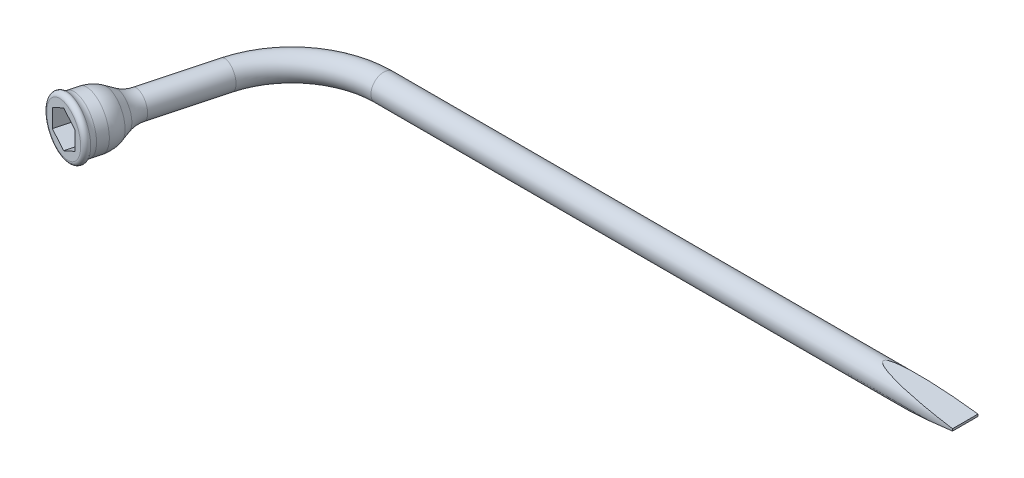
ISO-10303-21;
HEADER;
FILE_DESCRIPTION(('STEP AP214'),'2;1');
FILE_NAME('part.step','',(''),(''),'','','');
FILE_SCHEMA(('AUTOMOTIVE_DESIGN { 1 0 10303 214 1 1 1 1 }'));
ENDSEC;
DATA;
#1=APPLICATION_CONTEXT('core data for automotive mechanical design processes');
#2=APPLICATION_PROTOCOL_DEFINITION('international standard','automotive_design',2000,#1);
#3=PRODUCT_CONTEXT('',#1,'mechanical');
#4=PRODUCT('Part','Part','',(#3));
#5=PRODUCT_RELATED_PRODUCT_CATEGORY('part','',(#4));
#6=PRODUCT_DEFINITION_FORMATION('','',#4);
#7=PRODUCT_DEFINITION_CONTEXT('part definition',#1,'design');
#8=PRODUCT_DEFINITION('design','',#6,#7);
#9=PRODUCT_DEFINITION_SHAPE('','',#8);
#10=(LENGTH_UNIT() NAMED_UNIT(*) SI_UNIT(.MILLI.,.METRE.));
#11=(NAMED_UNIT(*) PLANE_ANGLE_UNIT() SI_UNIT($,.RADIAN.));
#12=(NAMED_UNIT(*) SI_UNIT($,.STERADIAN.) SOLID_ANGLE_UNIT());
#13=UNCERTAINTY_MEASURE_WITH_UNIT(LENGTH_MEASURE(1.E-05),#10,'distance_accuracy_value','');
#14=(GEOMETRIC_REPRESENTATION_CONTEXT(3) GLOBAL_UNCERTAINTY_ASSIGNED_CONTEXT((#13)) GLOBAL_UNIT_ASSIGNED_CONTEXT((#10,
#11,#12)) REPRESENTATION_CONTEXT('',''));
#15=CARTESIAN_POINT('',(0.,0.,0.));
#16=DIRECTION('',(0.,0.,1.));
#17=DIRECTION('',(1.,0.,0.));
#18=AXIS2_PLACEMENT_3D('',#15,#16,#17);
#19=CARTESIAN_POINT('',(43.8911037123964,0.,0.));
#20=DIRECTION('',(1.,0.,0.));
#21=DIRECTION('',(0.,0.,-1.));
#22=AXIS2_PLACEMENT_3D('',#19,#20,#21);
#23=CYLINDRICAL_SURFACE('',#22,7.95);
#24=CARTESIAN_POINT('',(43.8911037123964,0.,0.));
#25=DIRECTION('',(1.,0.,0.));
#26=DIRECTION('',(0.,0.,-1.));
#27=AXIS2_PLACEMENT_3D('',#24,#25,#26);
#28=CIRCLE('',#27,7.95);
#29=CARTESIAN_POINT('',(43.8911037123964,0.,-7.94999999999999));
#30=VERTEX_POINT('',#29);
#31=EDGE_CURVE('E111',#30,#30,#28,.T.);
#32=ORIENTED_EDGE('',*,*,#31,.T.);
#33=EDGE_LOOP('',(#32));
#34=FACE_BOUND('',#33,.T.);
#35=CARTESIAN_POINT('',(406.4,0.,0.));
#36=DIRECTION('',(1.,0.,0.));
#37=DIRECTION('',(0.,0.,-1.));
#38=AXIS2_PLACEMENT_3D('',#35,#36,#37);
#39=CIRCLE('',#38,7.95);
#40=CARTESIAN_POINT('',(406.4,0.649999999999999,7.92338311581612));
#41=VERTEX_POINT('',#40);
#42=CARTESIAN_POINT('',(406.4,-0.650000000000001,7.92338311581609));
#43=VERTEX_POINT('',#42);
#44=EDGE_CURVE('E98',#41,#43,#39,.T.);
#45=ORIENTED_EDGE('',*,*,#44,.F.);
#46=CARTESIAN_POINT('',(410.941095890411,0.,0.));
#47=DIRECTION('',(0.141693091083961,0.989910636340004,0.));
#48=DIRECTION('',(0.989910636340004,-0.141693091083961,0.));
#49=AXIS2_PLACEMENT_3D('',#46,#47,#48);
#50=ELLIPSE('',#49,56.1071816500154,7.95);
#51=CARTESIAN_POINT('',(406.4,0.649999999999999,-7.92338311581609));
#52=VERTEX_POINT('',#51);
#53=EDGE_CURVE('E103',#41,#52,#50,.F.);
#54=ORIENTED_EDGE('',*,*,#53,.T.);
#55=CARTESIAN_POINT('',(406.4,-0.650000000000001,-7.92338311581612));
#56=VERTEX_POINT('',#55);
#57=EDGE_CURVE('E48',#56,#52,#39,.T.);
#58=ORIENTED_EDGE('',*,*,#57,.F.);
#59=CARTESIAN_POINT('',(410.941095890411,0.,0.));
#60=DIRECTION('',(0.141693091083962,-0.989910636340004,0.));
#61=DIRECTION('',(0.989910636340004,0.141693091083962,0.));
#62=AXIS2_PLACEMENT_3D('',#59,#60,#61);
#63=ELLIPSE('',#62,56.1071816500153,7.95);
#64=EDGE_CURVE('E97',#56,#43,#63,.F.);
#65=ORIENTED_EDGE('',*,*,#64,.T.);
#66=EDGE_LOOP('',(#45,#54,#58,#65));
#67=FACE_BOUND('',#66,.T.);
#68=ADVANCED_FACE('F32',(#34,#67),#23,.T.);
#69=CARTESIAN_POINT('',(406.4,0.,0.));
#70=DIRECTION('',(1.,0.,0.));
#71=DIRECTION('',(0.,0.,-1.));
#72=AXIS2_PLACEMENT_3D('',#69,#70,#71);
#73=PLANE('',#72);
#74=DIRECTION('',(0.,0.,-1.));
#75=VECTOR('',#74,1.);
#76=CARTESIAN_POINT('',(406.4,-0.650000000000001,0.));
#77=LINE('',#76,#75);
#78=EDGE_CURVE('E36',#43,#56,#77,.T.);
#79=ORIENTED_EDGE('',*,*,#78,.T.);
#80=ORIENTED_EDGE('',*,*,#57,.T.);
#81=DIRECTION('',(0.,0.,-1.));
#82=VECTOR('',#81,1.);
#83=CARTESIAN_POINT('',(406.4,0.649999999999999,700.148681079432));
#84=LINE('',#83,#82);
#85=EDGE_CURVE('E11',#41,#52,#84,.T.);
#86=ORIENTED_EDGE('',*,*,#85,.F.);
#87=ORIENTED_EDGE('',*,*,#44,.T.);
#88=EDGE_LOOP('',(#79,#80,#86,#87));
#89=FACE_BOUND('',#88,.T.);
#90=ADVANCED_FACE('F105',(#89),#73,.T.);
#91=CARTESIAN_POINT('',(-11.3598535513383,0.,42.3955506201356));
#92=DIRECTION('',(-0.258819045102525,0.,0.965925826289067));
#93=DIRECTION('',(0.965925826289067,0.,0.258819045102525));
#94=AXIS2_PLACEMENT_3D('',#91,#92,#93);
#95=CYLINDRICAL_SURFACE('',#94,7.95);
#96=CARTESIAN_POINT('',(-23.0090131096145,0.,85.8708059570981));
#97=DIRECTION('',(0.258819045102525,0.,-0.965925826289067));
#98=DIRECTION('',(-0.965925826289067,0.,-0.258819045102525));
#99=AXIS2_PLACEMENT_3D('',#96,#97,#98);
#100=CIRCLE('',#99,7.94999999999999);
#101=CARTESIAN_POINT('',(-30.6881234286125,0.,83.813194548533));
#102=VERTEX_POINT('',#101);
#103=EDGE_CURVE('E134',#102,#102,#100,.T.);
#104=ORIENTED_EDGE('',*,*,#103,.T.);
#105=EDGE_LOOP('',(#104));
#106=FACE_BOUND('',#105,.T.);
#107=CARTESIAN_POINT('',(-11.3598535513383,0.,42.3955506201356));
#108=DIRECTION('',(0.258819045102525,0.,-0.965925826289067));
#109=DIRECTION('',(-0.965925826289067,0.,-0.258819045102525));
#110=AXIS2_PLACEMENT_3D('',#107,#108,#109);
#111=CIRCLE('',#110,7.95);
#112=CARTESIAN_POINT('',(-19.0389638703364,0.,40.3379392115705));
#113=VERTEX_POINT('',#112);
#114=EDGE_CURVE('E109',#113,#113,#111,.T.);
#115=ORIENTED_EDGE('',*,*,#114,.F.);
#116=EDGE_LOOP('',(#115));
#117=FACE_BOUND('',#116,.T.);
#118=ADVANCED_FACE('F34',(#106,#117),#95,.T.);
#119=CARTESIAN_POINT('',(43.8911037123963,0.,57.2));
#120=DIRECTION('',(0.,1.,0.));
#121=DIRECTION('',(0.,0.,1.));
#122=AXIS2_PLACEMENT_3D('',#119,#120,#121);
#123=TOROIDAL_SURFACE('',#122,57.2,7.95);
#124=CARTESIAN_POINT('',(43.8911037123963,0.,57.2));
#125=DIRECTION('',(0.,1.,0.));
#126=DIRECTION('',(0.,0.,1.));
#127=AXIS2_PLACEMENT_3D('',#124,#125,#126);
#128=CIRCLE('',#127,65.15);
#129=EDGE_CURVE('',#30,#113,#128,.T.);
#130=ORIENTED_EDGE('',*,*,#31,.F.);
#131=ORIENTED_EDGE('',*,*,#114,.T.);
#132=ORIENTED_EDGE('',*,*,#129,.T.);
#133=ORIENTED_EDGE('',*,*,#129,.F.);
#134=EDGE_LOOP('',(#130,#132,#131,#133));
#135=FACE_BOUND('',#134,.T.);
#136=ADVANCED_FACE('F248',(#135),#123,.T.);
#137=CARTESIAN_POINT('',(-32.2229711152643,0.,120.257765372989));
#138=DIRECTION('',(0.258819045102525,0.,-0.965925826289067));
#139=DIRECTION('',(-0.965925826289067,0.,-0.258819045102525));
#140=AXIS2_PLACEMENT_3D('',#137,#138,#139);
#141=TOROIDAL_SURFACE('',#140,14.95,2.49999999999998);
#142=CARTESIAN_POINT('',(-32.8700187280206,0.,122.672579938712));
#143=DIRECTION('',(0.258819045102525,0.,-0.965925826289067));
#144=DIRECTION('',(-0.965925826289067,0.,-0.258819045102525));
#145=AXIS2_PLACEMENT_3D('',#142,#143,#144);
#146=CIRCLE('',#145,14.95);
#147=CARTESIAN_POINT('',(-47.3106098310422,0.,118.803235214429));
#148=VERTEX_POINT('',#147);
#149=EDGE_CURVE('E106',#148,#148,#146,.T.);
#150=ORIENTED_EDGE('',*,*,#149,.T.);
#151=EDGE_LOOP('',(#150));
#152=FACE_BOUND('',#151,.T.);
#153=CARTESIAN_POINT('',(-31.8581006047408,0.,118.896050089531));
#154=DIRECTION('',(0.258819045102525,0.,-0.965925826289067));
#155=DIRECTION('',(-0.965925826289067,0.,-0.258819045102525));
#156=AXIS2_PLACEMENT_3D('',#153,#154,#155);
#157=CIRCLE('',#156,17.014606741573);
#158=CARTESIAN_POINT('',(-48.2929486805782,0.,114.492345819883));
#159=VERTEX_POINT('',#158);
#160=EDGE_CURVE('E119',#159,#159,#157,.T.);
#161=ORIENTED_EDGE('',*,*,#160,.F.);
#162=EDGE_LOOP('',(#161));
#163=FACE_BOUND('',#162,.T.);
#164=ADVANCED_FACE('F250',(#152,#163),#141,.T.);
#165=CARTESIAN_POINT('',(-30.9240320978006,0.,115.410058963881));
#166=DIRECTION('',(0.258819045102525,0.,-0.965925826289067));
#167=DIRECTION('',(-0.965925826289067,0.,-0.258819045102525));
#168=AXIS2_PLACEMENT_3D('',#165,#166,#167);
#169=TOROIDAL_SURFACE('',#168,22.3,6.4);
#170=ORIENTED_EDGE('',*,*,#160,.T.);
#171=EDGE_LOOP('',(#170));
#172=FACE_BOUND('',#171,.T.);
#173=CARTESIAN_POINT('',(-30.9240320978006,0.,115.410058963881));
#174=DIRECTION('',(0.258819045102525,0.,-0.965925826289067));
#175=DIRECTION('',(-0.965925826289067,0.,-0.258819045102525));
#176=AXIS2_PLACEMENT_3D('',#173,#174,#175);
#177=CIRCLE('',#176,15.9);
#178=CARTESIAN_POINT('',(-46.2822527357967,0.,111.29483614675));
#179=VERTEX_POINT('',#178);
#180=EDGE_CURVE('E122',#179,#179,#177,.T.);
#181=ORIENTED_EDGE('',*,*,#180,.F.);
#182=EDGE_LOOP('',(#181));
#183=FACE_BOUND('',#182,.T.);
#184=ADVANCED_FACE('F256',(#172,#183),#169,.F.);
#185=CARTESIAN_POINT('',(-15.1267657655725,0.,56.4538583913093));
#186=DIRECTION('',(0.258819045102525,0.,-0.965925826289067));
#187=DIRECTION('',(-0.965925826289067,0.,-0.258819045102525));
#188=AXIS2_PLACEMENT_3D('',#185,#186,#187);
#189=CYLINDRICAL_SURFACE('',#188,15.9);
#190=ORIENTED_EDGE('',*,*,#180,.T.);
#191=EDGE_LOOP('',(#190));
#192=FACE_BOUND('',#191,.T.);
#193=CARTESIAN_POINT('',(-29.237556879573,0.,109.11604776375));
#194=DIRECTION('',(0.258819045102525,0.,-0.965925826289067));
#195=DIRECTION('',(-0.965925826289067,0.,-0.258819045102525));
#196=AXIS2_PLACEMENT_3D('',#193,#194,#195);
#197=CIRCLE('',#196,15.9);
#198=CARTESIAN_POINT('',(-44.5957775175691,0.,105.000824946619));
#199=VERTEX_POINT('',#198);
#200=EDGE_CURVE('E125',#199,#199,#197,.T.);
#201=ORIENTED_EDGE('',*,*,#200,.F.);
#202=EDGE_LOOP('',(#201));
#203=FACE_BOUND('',#202,.T.);
#204=ADVANCED_FACE('F286',(#192,#203),#189,.T.);
#205=CARTESIAN_POINT('',(-29.237556879573,0.,109.11604776375));
#206=DIRECTION('',(0.258819045102525,0.,-0.965925826289067));
#207=DIRECTION('',(-0.965925826289067,0.,-0.258819045102525));
#208=AXIS2_PLACEMENT_3D('',#205,#206,#207);
#209=DEGENERATE_TOROIDAL_SURFACE('',#208,3.20000000000003,19.1,.F.);
#210=ORIENTED_EDGE('',*,*,#200,.T.);
#211=EDGE_LOOP('',(#210));
#212=FACE_BOUND('',#211,.T.);
#213=CARTESIAN_POINT('',(-26.7878765285635,0.,99.973716231479));
#214=DIRECTION('',(0.258819045102525,0.,-0.965925826289067));
#215=DIRECTION('',(-0.965925826289067,0.,-0.258819045102525));
#216=AXIS2_PLACEMENT_3D('',#213,#214,#215);
#217=CIRCLE('',#216,13.3899620352769);
#218=CARTESIAN_POINT('',(-39.7215866714675,0.,96.5081390435496));
#219=VERTEX_POINT('',#218);
#220=EDGE_CURVE('E128',#219,#219,#217,.T.);
#221=ORIENTED_EDGE('',*,*,#220,.F.);
#222=EDGE_LOOP('',(#221));
#223=FACE_BOUND('',#222,.T.);
#224=ADVANCED_FACE('F278',(#212,#223),#209,.F.);
#225=CARTESIAN_POINT('',(-25.458693460624,0.,95.0131374893686));
#226=DIRECTION('',(-0.258819045102525,0.,0.965925826289067));
#227=DIRECTION('',(0.965925826289067,0.,0.258819045102525));
#228=AXIS2_PLACEMENT_3D('',#225,#226,#227);
#229=CONICAL_SURFACE('',#228,10.4600379647231,0.518457872986273);
#230=ORIENTED_EDGE('',*,*,#220,.T.);
#231=EDGE_LOOP('',(#230));
#232=FACE_BOUND('',#231,.T.);
#233=CARTESIAN_POINT('',(-25.458693460624,0.,95.0131374893686));
#234=DIRECTION('',(0.258819045102525,0.,-0.965925826289067));
#235=DIRECTION('',(-0.965925826289067,0.,-0.258819045102525));
#236=AXIS2_PLACEMENT_3D('',#233,#234,#235);
#237=CIRCLE('',#236,10.4600379647231);
#238=CARTESIAN_POINT('',(-35.5623142747141,0.,92.3058804516028));
#239=VERTEX_POINT('',#238);
#240=EDGE_CURVE('E131',#239,#239,#237,.T.);
#241=ORIENTED_EDGE('',*,*,#240,.F.);
#242=EDGE_LOOP('',(#241));
#243=FACE_BOUND('',#242,.T.);
#244=ADVANCED_FACE('F269',(#232,#243),#229,.T.);
#245=CARTESIAN_POINT('',(-23.0090131096145,0.,85.8708059570981));
#246=DIRECTION('',(0.258819045102525,0.,-0.965925826289067));
#247=DIRECTION('',(-0.965925826289067,0.,-0.258819045102525));
#248=AXIS2_PLACEMENT_3D('',#245,#246,#247);
#249=TOROIDAL_SURFACE('',#248,27.05,19.1);
#250=ORIENTED_EDGE('',*,*,#240,.T.);
#251=EDGE_LOOP('',(#250));
#252=FACE_BOUND('',#251,.T.);
#253=ORIENTED_EDGE('',*,*,#103,.F.);
#254=EDGE_LOOP('',(#253));
#255=FACE_BOUND('',#254,.T.);
#256=ADVANCED_FACE('F266',(#252,#255),#249,.F.);
#257=CARTESIAN_POINT('',(-32.8700187280206,0.,122.672579938712));
#258=DIRECTION('',(0.258819045102525,0.,-0.965925826289067));
#259=DIRECTION('',(-0.965925826289067,0.,-0.258819045102525));
#260=AXIS2_PLACEMENT_3D('',#257,#258,#259);
#261=PLANE('',#260);
#262=DIRECTION('',(0.,1.,0.));
#263=VECTOR('',#262,1.);
#264=CARTESIAN_POINT('',(-23.21076046513,-5.77350269189626,125.260770389737));
#265=LINE('',#264,#263);
#266=CARTESIAN_POINT('',(-23.21076046513,-5.77350269189626,125.260770389737));
#267=VERTEX_POINT('',#266);
#268=CARTESIAN_POINT('',(-23.21076046513,5.77350269189626,125.260770389737));
#269=VERTEX_POINT('',#268);
#270=EDGE_CURVE('E164',#267,#269,#265,.T.);
#271=ORIENTED_EDGE('',*,*,#270,.F.);
#272=DIRECTION('',(0.836516303737807,0.5,0.224143868042016));
#273=VECTOR('',#272,1.);
#274=CARTESIAN_POINT('',(-32.8700187280206,-11.5470053837925,122.672579938712));
#275=LINE('',#274,#273);
#276=CARTESIAN_POINT('',(-32.8700187280206,-11.5470053837925,122.672579938712));
#277=VERTEX_POINT('',#276);
#278=EDGE_CURVE('E167',#277,#267,#275,.T.);
#279=ORIENTED_EDGE('',*,*,#278,.F.);
#280=DIRECTION('',(0.836516303737807,-0.5,0.224143868042017));
#281=VECTOR('',#280,1.);
#282=CARTESIAN_POINT('',(-42.5292769909113,-5.77350269189626,120.084389487686));
#283=LINE('',#282,#281);
#284=CARTESIAN_POINT('',(-42.5292769909113,-5.77350269189626,120.084389487686));
#285=VERTEX_POINT('',#284);
#286=EDGE_CURVE('E151',#285,#277,#283,.T.);
#287=ORIENTED_EDGE('',*,*,#286,.F.);
#288=DIRECTION('',(0.,-1.,0.));
#289=VECTOR('',#288,1.);
#290=CARTESIAN_POINT('',(-42.5292769909113,5.77350269189626,120.084389487686));
#291=LINE('',#290,#289);
#292=CARTESIAN_POINT('',(-42.5292769909113,5.77350269189626,120.084389487686));
#293=VERTEX_POINT('',#292);
#294=EDGE_CURVE('E155',#293,#285,#291,.T.);
#295=ORIENTED_EDGE('',*,*,#294,.F.);
#296=DIRECTION('',(-0.836516303737807,-0.5,-0.224143868042017));
#297=VECTOR('',#296,1.);
#298=CARTESIAN_POINT('',(-32.8700187280206,11.5470053837925,122.672579938712));
#299=LINE('',#298,#297);
#300=CARTESIAN_POINT('',(-32.8700187280206,11.5470053837925,122.672579938712));
#301=VERTEX_POINT('',#300);
#302=EDGE_CURVE('E158',#301,#293,#299,.T.);
#303=ORIENTED_EDGE('',*,*,#302,.F.);
#304=DIRECTION('',(-0.836516303737807,0.5,-0.224143868042016));
#305=VECTOR('',#304,1.);
#306=CARTESIAN_POINT('',(-23.21076046513,5.77350269189626,125.260770389737));
#307=LINE('',#306,#305);
#308=EDGE_CURVE('E161',#269,#301,#307,.T.);
#309=ORIENTED_EDGE('',*,*,#308,.F.);
#310=EDGE_LOOP('',(#271,#279,#287,#295,#303,#309));
#311=FACE_BOUND('',#310,.T.);
#312=ORIENTED_EDGE('',*,*,#149,.F.);
#313=EDGE_LOOP('',(#312));
#314=FACE_BOUND('',#313,.T.);
#315=ADVANCED_FACE('F268',(#311,#314),#261,.F.);
#316=CARTESIAN_POINT('',(-29.5830168552186,-11.5470053837925,110.40532194484));
#317=DIRECTION('',(0.482962913144534,-0.866025403784439,0.129409522551262));
#318=DIRECTION('',(0.873369362327711,0.487058473848149,0.));
#319=AXIS2_PLACEMENT_3D('',#316,#317,#318);
#320=PLANE('',#319);
#321=ORIENTED_EDGE('',*,*,#278,.T.);
#322=DIRECTION('',(-0.258819045102525,0.,0.965925826289067));
#323=VECTOR('',#322,1.);
#324=CARTESIAN_POINT('',(-19.9237585923279,-5.77350269189626,112.993512395866));
#325=LINE('',#324,#323);
#326=CARTESIAN_POINT('',(-19.9237585923279,-5.77350269189626,112.993512395866));
#327=VERTEX_POINT('',#326);
#328=EDGE_CURVE('E138',#327,#267,#325,.T.);
#329=ORIENTED_EDGE('',*,*,#328,.F.);
#330=DIRECTION('',(0.836516303737807,0.5,0.224143868042016));
#331=VECTOR('',#330,1.);
#332=CARTESIAN_POINT('',(-29.5830168552186,-11.5470053837925,110.40532194484));
#333=LINE('',#332,#331);
#334=CARTESIAN_POINT('',(-29.5830168552186,-11.5470053837925,110.40532194484));
#335=VERTEX_POINT('',#334);
#336=EDGE_CURVE('E154',#335,#327,#333,.T.);
#337=ORIENTED_EDGE('',*,*,#336,.F.);
#338=DIRECTION('',(-0.258819045102525,0.,0.965925826289067));
#339=VECTOR('',#338,1.);
#340=CARTESIAN_POINT('',(-29.5830168552186,-11.5470053837925,110.40532194484));
#341=LINE('',#340,#339);
#342=EDGE_CURVE('E137',#335,#277,#341,.T.);
#343=ORIENTED_EDGE('',*,*,#342,.T.);
#344=EDGE_LOOP('',(#321,#329,#337,#343));
#345=FACE_BOUND('',#344,.T.);
#346=ADVANCED_FACE('F276',(#345),#320,.F.);
#347=CARTESIAN_POINT('',(-39.2422751181092,-5.77350269189626,107.817131493815));
#348=DIRECTION('',(-0.482962913144534,-0.866025403784439,-0.129409522551262));
#349=DIRECTION('',(0.873369362327711,-0.487058473848148,0.));
#350=AXIS2_PLACEMENT_3D('',#347,#348,#349);
#351=PLANE('',#350);
#352=ORIENTED_EDGE('',*,*,#286,.T.);
#353=ORIENTED_EDGE('',*,*,#342,.F.);
#354=DIRECTION('',(0.836516303737807,-0.5,0.224143868042017));
#355=VECTOR('',#354,1.);
#356=CARTESIAN_POINT('',(-39.2422751181092,-5.77350269189626,107.817131493815));
#357=LINE('',#356,#355);
#358=CARTESIAN_POINT('',(-39.2422751181092,-5.77350269189626,107.817131493815));
#359=VERTEX_POINT('',#358);
#360=EDGE_CURVE('E142',#359,#335,#357,.T.);
#361=ORIENTED_EDGE('',*,*,#360,.F.);
#362=DIRECTION('',(-0.258819045102525,0.,0.965925826289067));
#363=VECTOR('',#362,1.);
#364=CARTESIAN_POINT('',(-39.2422751181092,-5.77350269189626,107.817131493815));
#365=LINE('',#364,#363);
#366=EDGE_CURVE('E148',#359,#285,#365,.T.);
#367=ORIENTED_EDGE('',*,*,#366,.T.);
#368=EDGE_LOOP('',(#352,#353,#361,#367));
#369=FACE_BOUND('',#368,.T.);
#370=ADVANCED_FACE('F339',(#369),#351,.F.);
#371=CARTESIAN_POINT('',(-39.2422751181092,5.77350269189626,107.817131493815));
#372=DIRECTION('',(-0.965925826289067,0.,-0.258819045102525));
#373=DIRECTION('',(-0.258819045102525,0.,0.965925826289067));
#374=AXIS2_PLACEMENT_3D('',#371,#372,#373);
#375=PLANE('',#374);
#376=ORIENTED_EDGE('',*,*,#294,.T.);
#377=ORIENTED_EDGE('',*,*,#366,.F.);
#378=DIRECTION('',(0.,-1.,0.));
#379=VECTOR('',#378,1.);
#380=CARTESIAN_POINT('',(-39.2422751181092,5.77350269189626,107.817131493815));
#381=LINE('',#380,#379);
#382=CARTESIAN_POINT('',(-39.2422751181092,5.77350269189626,107.817131493815));
#383=VERTEX_POINT('',#382);
#384=EDGE_CURVE('E172',#383,#359,#381,.T.);
#385=ORIENTED_EDGE('',*,*,#384,.F.);
#386=DIRECTION('',(-0.258819045102525,0.,0.965925826289067));
#387=VECTOR('',#386,1.);
#388=CARTESIAN_POINT('',(-39.2422751181092,5.77350269189626,107.817131493815));
#389=LINE('',#388,#387);
#390=EDGE_CURVE('E146',#383,#293,#389,.T.);
#391=ORIENTED_EDGE('',*,*,#390,.T.);
#392=EDGE_LOOP('',(#376,#377,#385,#391));
#393=FACE_BOUND('',#392,.T.);
#394=ADVANCED_FACE('F348',(#393),#375,.F.);
#395=CARTESIAN_POINT('',(-29.5830168552186,11.5470053837925,110.40532194484));
#396=DIRECTION('',(-0.482962913144534,0.866025403784439,-0.129409522551262));
#397=DIRECTION('',(-0.873369362327711,-0.487058473848148,0.));
#398=AXIS2_PLACEMENT_3D('',#395,#396,#397);
#399=PLANE('',#398);
#400=ORIENTED_EDGE('',*,*,#302,.T.);
#401=ORIENTED_EDGE('',*,*,#390,.F.);
#402=DIRECTION('',(-0.836516303737807,-0.5,-0.224143868042017));
#403=VECTOR('',#402,1.);
#404=CARTESIAN_POINT('',(-29.5830168552186,11.5470053837925,110.40532194484));
#405=LINE('',#404,#403);
#406=CARTESIAN_POINT('',(-29.5830168552186,11.5470053837925,110.40532194484));
#407=VERTEX_POINT('',#406);
#408=EDGE_CURVE('E174',#407,#383,#405,.T.);
#409=ORIENTED_EDGE('',*,*,#408,.F.);
#410=DIRECTION('',(-0.258819045102525,0.,0.965925826289067));
#411=VECTOR('',#410,1.);
#412=CARTESIAN_POINT('',(-29.5830168552186,11.5470053837925,110.40532194484));
#413=LINE('',#412,#411);
#414=EDGE_CURVE('E144',#407,#301,#413,.T.);
#415=ORIENTED_EDGE('',*,*,#414,.T.);
#416=EDGE_LOOP('',(#400,#401,#409,#415));
#417=FACE_BOUND('',#416,.T.);
#418=ADVANCED_FACE('F358',(#417),#399,.F.);
#419=CARTESIAN_POINT('',(-19.9237585923279,5.77350269189626,112.993512395866));
#420=DIRECTION('',(0.482962913144534,0.866025403784439,0.129409522551262));
#421=DIRECTION('',(-0.873369362327711,0.487058473848148,0.));
#422=AXIS2_PLACEMENT_3D('',#419,#420,#421);
#423=PLANE('',#422);
#424=ORIENTED_EDGE('',*,*,#308,.T.);
#425=ORIENTED_EDGE('',*,*,#414,.F.);
#426=DIRECTION('',(-0.836516303737807,0.5,-0.224143868042016));
#427=VECTOR('',#426,1.);
#428=CARTESIAN_POINT('',(-19.9237585923279,5.77350269189626,112.993512395866));
#429=LINE('',#428,#427);
#430=CARTESIAN_POINT('',(-19.9237585923279,5.77350269189626,112.993512395866));
#431=VERTEX_POINT('',#430);
#432=EDGE_CURVE('E177',#431,#407,#429,.T.);
#433=ORIENTED_EDGE('',*,*,#432,.F.);
#434=DIRECTION('',(-0.258819045102525,0.,0.965925826289067));
#435=VECTOR('',#434,1.);
#436=CARTESIAN_POINT('',(-19.9237585923279,5.77350269189626,112.993512395866));
#437=LINE('',#436,#435);
#438=EDGE_CURVE('E141',#431,#269,#437,.T.);
#439=ORIENTED_EDGE('',*,*,#438,.T.);
#440=EDGE_LOOP('',(#424,#425,#433,#439));
#441=FACE_BOUND('',#440,.T.);
#442=ADVANCED_FACE('F368',(#441),#423,.F.);
#443=CARTESIAN_POINT('',(-19.9237585923279,-5.77350269189626,112.993512395866));
#444=DIRECTION('',(0.965925826289067,0.,0.258819045102525));
#445=DIRECTION('',(0.258819045102525,0.,-0.965925826289067));
#446=AXIS2_PLACEMENT_3D('',#443,#444,#445);
#447=PLANE('',#446);
#448=ORIENTED_EDGE('',*,*,#270,.T.);
#449=ORIENTED_EDGE('',*,*,#438,.F.);
#450=DIRECTION('',(0.,1.,0.));
#451=VECTOR('',#450,1.);
#452=CARTESIAN_POINT('',(-19.9237585923279,-5.77350269189626,112.993512395866));
#453=LINE('',#452,#451);
#454=EDGE_CURVE('E180',#327,#431,#453,.T.);
#455=ORIENTED_EDGE('',*,*,#454,.F.);
#456=ORIENTED_EDGE('',*,*,#328,.T.);
#457=EDGE_LOOP('',(#448,#449,#455,#456));
#458=FACE_BOUND('',#457,.T.);
#459=ADVANCED_FACE('F378',(#458),#447,.F.);
#460=CARTESIAN_POINT('',(-39.2422751181092,5.77350269189626,107.817131493815));
#461=CARTESIAN_POINT('',(-37.1028703163086,5.48482755730145,101.764615728116));
#462=CARTESIAN_POINT('',(-27.9265749665624,0.,104.22339665659));
#463=CARTESIAN_POINT('',(-39.2422751181092,-5.77350269189626,107.817131493815));
#464=CARTESIAN_POINT('',(-37.1028703163086,-5.48482755730144,101.764615728116));
#465=CARTESIAN_POINT('',(-27.9265749665624,0.,104.22339665659));
#466=(BOUNDED_SURFACE() B_SPLINE_SURFACE(1,2,((#460,#461,#462),(#463,#464,#465)),.UNSPECIFIED.,
.F.,.F.,.F.) B_SPLINE_SURFACE_WITH_KNOTS((2,2),(3,3),(0.,1.),(0.,1.),
.UNSPECIFIED.) GEOMETRIC_REPRESENTATION_ITEM() RATIONAL_B_SPLINE_SURFACE(((1.,1.,1.),(1.,1.,1.))) REPRESENTATION_ITEM('') SURFACE());
#467=CARTESIAN_POINT('',(-39.2422751181092,-5.77350269189626,107.817131493815));
#468=CARTESIAN_POINT('',(-37.1028703163086,-5.48482755730144,101.764615728116));
#469=CARTESIAN_POINT('',(-27.9265749665624,0.,104.22339665659));
#470=(BOUNDED_CURVE() B_SPLINE_CURVE(2,(#467,#468,#469),.UNSPECIFIED.,.F.,
.F.) B_SPLINE_CURVE_WITH_KNOTS((3,3),(0.,1.),
.UNSPECIFIED.) CURVE() GEOMETRIC_REPRESENTATION_ITEM() RATIONAL_B_SPLINE_CURVE((1.,1.,1.)) REPRESENTATION_ITEM(''));
#471=CARTESIAN_POINT('',(-27.9265749665624,0.,104.22339665659));
#472=VERTEX_POINT('',#471);
#473=EDGE_CURVE('E185',#359,#472,#470,.T.);
#474=CARTESIAN_POINT('',(-39.2422751181092,5.77350269189626,107.817131493815));
#475=CARTESIAN_POINT('',(-37.1028703163086,5.48482755730145,101.764615728116));
#476=CARTESIAN_POINT('',(-27.9265749665624,0.,104.22339665659));
#477=(BOUNDED_CURVE() B_SPLINE_CURVE(2,(#474,#475,#476),.UNSPECIFIED.,.F.,
.F.) B_SPLINE_CURVE_WITH_KNOTS((3,3),(0.,1.),
.UNSPECIFIED.) CURVE() GEOMETRIC_REPRESENTATION_ITEM() RATIONAL_B_SPLINE_CURVE((1.,1.,1.)) REPRESENTATION_ITEM(''));
#478=EDGE_CURVE('E190',#383,#472,#477,.T.);
#479=ORIENTED_EDGE('',*,*,#384,.T.);
#480=ORIENTED_EDGE('',*,*,#473,.T.);
#481=ORIENTED_EDGE('',*,*,#478,.F.);
#482=EDGE_LOOP('',(#479,#480,#481));
#483=FACE_BOUND('',#482,.T.);
#484=ADVANCED_FACE('F388',(#483),#466,.T.);
#485=CARTESIAN_POINT('',(-29.5830168552186,11.5470053837925,110.40532194484));
#486=CARTESIAN_POINT('',(-27.9265749665624,10.9696551146029,104.22339665659));
#487=CARTESIAN_POINT('',(-27.9265749665624,0.,104.22339665659));
#488=CARTESIAN_POINT('',(-39.2422751181092,5.77350269189626,107.817131493815));
#489=CARTESIAN_POINT('',(-37.1028703163086,5.48482755730145,101.764615728116));
#490=CARTESIAN_POINT('',(-27.9265749665624,0.,104.22339665659));
#491=(BOUNDED_SURFACE() B_SPLINE_SURFACE(1,2,((#485,#486,#487),(#488,#489,#490)),.UNSPECIFIED.,
.F.,.F.,.F.) B_SPLINE_SURFACE_WITH_KNOTS((2,2),(3,3),(0.,1.),(0.,1.),
.UNSPECIFIED.) GEOMETRIC_REPRESENTATION_ITEM() RATIONAL_B_SPLINE_SURFACE(((1.,1.,1.),(1.,1.,1.))) REPRESENTATION_ITEM('') SURFACE());
#492=CARTESIAN_POINT('',(-29.5830168552186,11.5470053837925,110.40532194484));
#493=CARTESIAN_POINT('',(-27.9265749665624,10.9696551146029,104.22339665659));
#494=CARTESIAN_POINT('',(-27.9265749665624,0.,104.22339665659));
#495=(BOUNDED_CURVE() B_SPLINE_CURVE(2,(#492,#493,#494),.UNSPECIFIED.,.F.,
.F.) B_SPLINE_CURVE_WITH_KNOTS((3,3),(0.,1.),
.UNSPECIFIED.) CURVE() GEOMETRIC_REPRESENTATION_ITEM() RATIONAL_B_SPLINE_CURVE((1.,1.,1.)) REPRESENTATION_ITEM(''));
#496=EDGE_CURVE('E197',#407,#472,#495,.T.);
#497=ORIENTED_EDGE('',*,*,#408,.T.);
#498=ORIENTED_EDGE('',*,*,#478,.T.);
#499=ORIENTED_EDGE('',*,*,#496,.F.);
#500=EDGE_LOOP('',(#497,#498,#499));
#501=FACE_BOUND('',#500,.T.);
#502=ADVANCED_FACE('F397',(#501),#491,.T.);
#503=CARTESIAN_POINT('',(-19.9237585923279,5.77350269189626,112.993512395866));
#504=CARTESIAN_POINT('',(-18.7502796168163,5.48482755730145,106.682177585064));
#505=CARTESIAN_POINT('',(-27.9265749665624,0.,104.22339665659));
#506=CARTESIAN_POINT('',(-29.5830168552186,11.5470053837925,110.40532194484));
#507=CARTESIAN_POINT('',(-27.9265749665624,10.9696551146029,104.22339665659));
#508=CARTESIAN_POINT('',(-27.9265749665624,0.,104.22339665659));
#509=(BOUNDED_SURFACE() B_SPLINE_SURFACE(1,2,((#503,#504,#505),(#506,#507,#508)),.UNSPECIFIED.,
.F.,.F.,.F.) B_SPLINE_SURFACE_WITH_KNOTS((2,2),(3,3),(0.,1.),(0.,1.),
.UNSPECIFIED.) GEOMETRIC_REPRESENTATION_ITEM() RATIONAL_B_SPLINE_SURFACE(((1.,1.,1.),(1.,1.,1.))) REPRESENTATION_ITEM('') SURFACE());
#510=CARTESIAN_POINT('',(-19.9237585923279,5.77350269189626,112.993512395866));
#511=CARTESIAN_POINT('',(-18.7502796168163,5.48482755730145,106.682177585064));
#512=CARTESIAN_POINT('',(-27.9265749665624,0.,104.22339665659));
#513=(BOUNDED_CURVE() B_SPLINE_CURVE(2,(#510,#511,#512),.UNSPECIFIED.,.F.,
.F.) B_SPLINE_CURVE_WITH_KNOTS((3,3),(0.,1.),
.UNSPECIFIED.) CURVE() GEOMETRIC_REPRESENTATION_ITEM() RATIONAL_B_SPLINE_CURVE((1.,1.,1.)) REPRESENTATION_ITEM(''));
#514=EDGE_CURVE('E205',#431,#472,#513,.T.);
#515=ORIENTED_EDGE('',*,*,#432,.T.);
#516=ORIENTED_EDGE('',*,*,#496,.T.);
#517=ORIENTED_EDGE('',*,*,#514,.F.);
#518=EDGE_LOOP('',(#515,#516,#517));
#519=FACE_BOUND('',#518,.T.);
#520=ADVANCED_FACE('F407',(#519),#509,.T.);
#521=CARTESIAN_POINT('',(-39.2422751181092,-5.77350269189626,107.817131493815));
#522=CARTESIAN_POINT('',(-37.1028703163086,-5.48482755730144,101.764615728116));
#523=CARTESIAN_POINT('',(-27.9265749665624,0.,104.22339665659));
#524=CARTESIAN_POINT('',(-29.5830168552186,-11.5470053837925,110.40532194484));
#525=CARTESIAN_POINT('',(-27.9265749665624,-10.9696551146029,104.22339665659));
#526=CARTESIAN_POINT('',(-27.9265749665624,0.,104.22339665659));
#527=(BOUNDED_SURFACE() B_SPLINE_SURFACE(1,2,((#521,#522,#523),(#524,#525,#526)),.UNSPECIFIED.,
.F.,.F.,.F.) B_SPLINE_SURFACE_WITH_KNOTS((2,2),(3,3),(0.,1.),(0.,1.),
.UNSPECIFIED.) GEOMETRIC_REPRESENTATION_ITEM() RATIONAL_B_SPLINE_SURFACE(((1.,1.,1.),(1.,1.,1.))) REPRESENTATION_ITEM('') SURFACE());
#528=CARTESIAN_POINT('',(-29.5830168552186,-11.5470053837925,110.40532194484));
#529=CARTESIAN_POINT('',(-27.9265749665624,-10.9696551146029,104.22339665659));
#530=CARTESIAN_POINT('',(-27.9265749665624,0.,104.22339665659));
#531=(BOUNDED_CURVE() B_SPLINE_CURVE(2,(#528,#529,#530),.UNSPECIFIED.,.F.,
.F.) B_SPLINE_CURVE_WITH_KNOTS((3,3),(0.,1.),
.UNSPECIFIED.) CURVE() GEOMETRIC_REPRESENTATION_ITEM() RATIONAL_B_SPLINE_CURVE((1.,1.,1.)) REPRESENTATION_ITEM(''));
#532=EDGE_CURVE('E213',#472,#335,#531,.F.);
#533=ORIENTED_EDGE('',*,*,#360,.T.);
#534=ORIENTED_EDGE('',*,*,#532,.F.);
#535=ORIENTED_EDGE('',*,*,#473,.F.);
#536=EDGE_LOOP('',(#533,#534,#535));
#537=FACE_BOUND('',#536,.T.);
#538=ADVANCED_FACE('F417',(#537),#527,.T.);
#539=CARTESIAN_POINT('',(-19.9237585923279,-5.77350269189626,112.993512395866));
#540=CARTESIAN_POINT('',(-18.7502796168163,-5.48482755730145,106.682177585064));
#541=CARTESIAN_POINT('',(-27.9265749665624,0.,104.22339665659));
#542=CARTESIAN_POINT('',(-19.9237585923279,5.77350269189626,112.993512395866));
#543=CARTESIAN_POINT('',(-18.7502796168163,5.48482755730145,106.682177585064));
#544=CARTESIAN_POINT('',(-27.9265749665624,0.,104.22339665659));
#545=(BOUNDED_SURFACE() B_SPLINE_SURFACE(1,2,((#539,#540,#541),(#542,#543,#544)),.UNSPECIFIED.,
.F.,.F.,.F.) B_SPLINE_SURFACE_WITH_KNOTS((2,2),(3,3),(0.,1.),(0.,1.),
.UNSPECIFIED.) GEOMETRIC_REPRESENTATION_ITEM() RATIONAL_B_SPLINE_SURFACE(((1.,1.,1.),(1.,1.,1.))) REPRESENTATION_ITEM('') SURFACE());
#546=CARTESIAN_POINT('',(-19.9237585923279,-5.77350269189626,112.993512395866));
#547=CARTESIAN_POINT('',(-18.7502796168163,-5.48482755730145,106.682177585064));
#548=CARTESIAN_POINT('',(-27.9265749665624,0.,104.22339665659));
#549=(BOUNDED_CURVE() B_SPLINE_CURVE(2,(#546,#547,#548),.UNSPECIFIED.,.F.,
.F.) B_SPLINE_CURVE_WITH_KNOTS((3,3),(0.,1.),
.UNSPECIFIED.) CURVE() GEOMETRIC_REPRESENTATION_ITEM() RATIONAL_B_SPLINE_CURVE((1.,1.,1.)) REPRESENTATION_ITEM(''));
#550=EDGE_CURVE('E169',#327,#472,#549,.T.);
#551=ORIENTED_EDGE('',*,*,#454,.T.);
#552=ORIENTED_EDGE('',*,*,#514,.T.);
#553=ORIENTED_EDGE('',*,*,#550,.F.);
#554=EDGE_LOOP('',(#551,#552,#553));
#555=FACE_BOUND('',#554,.T.);
#556=ADVANCED_FACE('F427',(#555),#545,.T.);
#557=CARTESIAN_POINT('',(-29.5830168552186,-11.5470053837925,110.40532194484));
#558=CARTESIAN_POINT('',(-27.9265749665624,-10.9696551146029,104.22339665659));
#559=CARTESIAN_POINT('',(-27.9265749665624,0.,104.22339665659));
#560=CARTESIAN_POINT('',(-19.9237585923279,-5.77350269189626,112.993512395866));
#561=CARTESIAN_POINT('',(-18.7502796168163,-5.48482755730145,106.682177585064));
#562=CARTESIAN_POINT('',(-27.9265749665624,0.,104.22339665659));
#563=(BOUNDED_SURFACE() B_SPLINE_SURFACE(1,2,((#557,#558,#559),(#560,#561,#562)),.UNSPECIFIED.,
.F.,.F.,.F.) B_SPLINE_SURFACE_WITH_KNOTS((2,2),(3,3),(0.,1.),(0.,1.),
.UNSPECIFIED.) GEOMETRIC_REPRESENTATION_ITEM() RATIONAL_B_SPLINE_SURFACE(((1.,1.,1.),(1.,1.,1.))) REPRESENTATION_ITEM('') SURFACE());
#564=ORIENTED_EDGE('',*,*,#336,.T.);
#565=ORIENTED_EDGE('',*,*,#550,.T.);
#566=ORIENTED_EDGE('',*,*,#532,.T.);
#567=EDGE_LOOP('',(#564,#565,#566));
#568=FACE_BOUND('',#567,.T.);
#569=ADVANCED_FACE('F237',(#568),#563,.T.);
#570=CARTESIAN_POINT('',(406.4,-0.650000000000001,700.148681079432));
#571=DIRECTION('',(0.141693091083962,-0.989910636340004,0.));
#572=DIRECTION('',(0.989910636340004,0.141693091083962,0.));
#573=AXIS2_PLACEMENT_3D('',#570,#571,#572);
#574=PLANE('',#573);
#575=ORIENTED_EDGE('',*,*,#64,.F.);
#576=ORIENTED_EDGE('',*,*,#78,.F.);
#577=EDGE_LOOP('',(#575,#576));
#578=FACE_BOUND('',#577,.T.);
#579=ADVANCED_FACE('F108',(#578),#574,.T.);
#580=CARTESIAN_POINT('',(406.4,0.649999999999999,700.148681079432));
#581=DIRECTION('',(0.141693091083961,0.989910636340004,0.));
#582=DIRECTION('',(-0.989910636340004,0.141693091083961,0.));
#583=AXIS2_PLACEMENT_3D('',#580,#581,#582);
#584=PLANE('',#583);
#585=ORIENTED_EDGE('',*,*,#53,.F.);
#586=ORIENTED_EDGE('',*,*,#85,.T.);
#587=EDGE_LOOP('',(#585,#586));
#588=FACE_BOUND('',#587,.T.);
#589=ADVANCED_FACE('F231',(#588),#584,.T.);
#590=CLOSED_SHELL('',(#68,#90,#118,#136,#164,#184,#204,#224,#244,#256,#315,#346,#370,#394,#418,
#442,#459,#484,#502,#520,#538,#556,#569,#579,#589));
#591=MANIFOLD_SOLID_BREP('B2',#590);
#592=ADVANCED_BREP_SHAPE_REPRESENTATION('',(#18,#591),#14);
#593=SHAPE_DEFINITION_REPRESENTATION(#9,#592);
ENDSEC;
END-ISO-10303-21;
